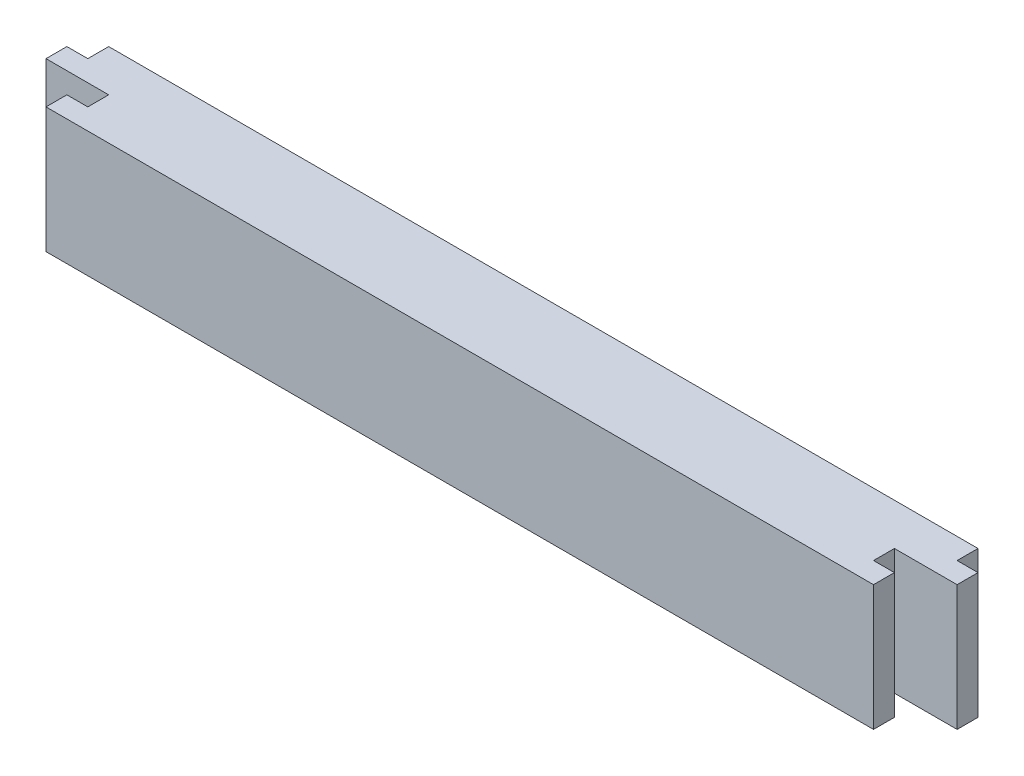
ISO-10303-21;
HEADER;
FILE_DESCRIPTION(('STEP AP214'),'2;1');
FILE_NAME('part.step','',(''),(''),'','','');
FILE_SCHEMA(('AUTOMOTIVE_DESIGN { 1 0 10303 214 1 1 1 1 }'));
ENDSEC;
DATA;
#1=APPLICATION_CONTEXT('core data for automotive mechanical design processes');
#2=APPLICATION_PROTOCOL_DEFINITION('international standard','automotive_design',2000,#1);
#3=PRODUCT_CONTEXT('',#1,'mechanical');
#4=PRODUCT('Part','Part','',(#3));
#5=PRODUCT_RELATED_PRODUCT_CATEGORY('part','',(#4));
#6=PRODUCT_DEFINITION_FORMATION('','',#4);
#7=PRODUCT_DEFINITION_CONTEXT('part definition',#1,'design');
#8=PRODUCT_DEFINITION('design','',#6,#7);
#9=PRODUCT_DEFINITION_SHAPE('','',#8);
#10=(LENGTH_UNIT() NAMED_UNIT(*) SI_UNIT(.MILLI.,.METRE.));
#11=(NAMED_UNIT(*) PLANE_ANGLE_UNIT() SI_UNIT($,.RADIAN.));
#12=(NAMED_UNIT(*) SI_UNIT($,.STERADIAN.) SOLID_ANGLE_UNIT());
#13=UNCERTAINTY_MEASURE_WITH_UNIT(LENGTH_MEASURE(1.E-05),#10,'distance_accuracy_value','');
#14=(GEOMETRIC_REPRESENTATION_CONTEXT(3) GLOBAL_UNCERTAINTY_ASSIGNED_CONTEXT((#13)) GLOBAL_UNIT_ASSIGNED_CONTEXT((#10,
#11,#12)) REPRESENTATION_CONTEXT('',''));
#15=CARTESIAN_POINT('',(0.,0.,0.));
#16=DIRECTION('',(0.,0.,1.));
#17=DIRECTION('',(1.,0.,0.));
#18=AXIS2_PLACEMENT_3D('',#15,#16,#17);
#19=CARTESIAN_POINT('',(26.,7.5,0.));
#20=DIRECTION('',(-1.,0.,0.));
#21=DIRECTION('',(0.,0.,1.));
#22=AXIS2_PLACEMENT_3D('',#19,#20,#21);
#23=PLANE('',#22);
#24=DIRECTION('',(0.,0.,-1.));
#25=VECTOR('',#24,1.);
#26=CARTESIAN_POINT('',(26.,0.,0.));
#27=LINE('',#26,#25);
#28=CARTESIAN_POINT('',(26.,0.,0.));
#29=VERTEX_POINT('',#28);
#30=CARTESIAN_POINT('',(26.,0.,-1.25));
#31=VERTEX_POINT('',#30);
#32=EDGE_CURVE('E193',#29,#31,#27,.T.);
#33=ORIENTED_EDGE('',*,*,#32,.T.);
#34=DIRECTION('',(0.,-1.,0.));
#35=VECTOR('',#34,1.);
#36=CARTESIAN_POINT('',(26.,7.5,-1.25));
#37=LINE('',#36,#35);
#38=CARTESIAN_POINT('',(26.,7.5,-1.25));
#39=VERTEX_POINT('',#38);
#40=EDGE_CURVE('E11',#39,#31,#37,.T.);
#41=ORIENTED_EDGE('',*,*,#40,.F.);
#42=DIRECTION('',(0.,0.,-1.));
#43=VECTOR('',#42,1.);
#44=CARTESIAN_POINT('',(26.,7.5,0.));
#45=LINE('',#44,#43);
#46=CARTESIAN_POINT('',(26.,7.5,0.));
#47=VERTEX_POINT('',#46);
#48=EDGE_CURVE('E242',#47,#39,#45,.T.);
#49=ORIENTED_EDGE('',*,*,#48,.F.);
#50=DIRECTION('',(0.,-1.,0.));
#51=VECTOR('',#50,1.);
#52=CARTESIAN_POINT('',(26.,7.5,0.));
#53=LINE('',#52,#51);
#54=EDGE_CURVE('E189',#47,#29,#53,.T.);
#55=ORIENTED_EDGE('',*,*,#54,.T.);
#56=EDGE_LOOP('',(#33,#41,#49,#55));
#57=FACE_BOUND('',#56,.T.);
#58=ADVANCED_FACE('F45',(#57),#23,.F.);
#59=CARTESIAN_POINT('',(-26.,7.5,-1.25));
#60=DIRECTION('',(0.,0.,1.));
#61=DIRECTION('',(1.,0.,0.));
#62=AXIS2_PLACEMENT_3D('',#59,#60,#61);
#63=PLANE('',#62);
#64=DIRECTION('',(-1.,0.,0.));
#65=VECTOR('',#64,1.);
#66=CARTESIAN_POINT('',(-26.,0.,-1.25));
#67=LINE('',#66,#65);
#68=CARTESIAN_POINT('',(-26.,0.,-1.25));
#69=VERTEX_POINT('',#68);
#70=EDGE_CURVE('E197',#31,#69,#67,.T.);
#71=ORIENTED_EDGE('',*,*,#70,.T.);
#72=DIRECTION('',(0.,-1.,0.));
#73=VECTOR('',#72,1.);
#74=CARTESIAN_POINT('',(-26.,7.5,-1.25));
#75=LINE('',#74,#73);
#76=CARTESIAN_POINT('',(-26.,7.5,-1.25));
#77=VERTEX_POINT('',#76);
#78=EDGE_CURVE('E54',#77,#69,#75,.T.);
#79=ORIENTED_EDGE('',*,*,#78,.F.);
#80=DIRECTION('',(-1.,0.,0.));
#81=VECTOR('',#80,1.);
#82=CARTESIAN_POINT('',(-26.,7.5,-1.25));
#83=LINE('',#82,#81);
#84=EDGE_CURVE('E129',#39,#77,#83,.T.);
#85=ORIENTED_EDGE('',*,*,#84,.F.);
#86=ORIENTED_EDGE('',*,*,#40,.T.);
#87=EDGE_LOOP('',(#71,#79,#85,#86));
#88=FACE_BOUND('',#87,.T.);
#89=ADVANCED_FACE('F364',(#88),#63,.F.);
#90=CARTESIAN_POINT('',(-26.,7.5,0.));
#91=DIRECTION('',(1.,0.,0.));
#92=DIRECTION('',(0.,0.,-1.));
#93=AXIS2_PLACEMENT_3D('',#90,#91,#92);
#94=PLANE('',#93);
#95=DIRECTION('',(0.,0.,1.));
#96=VECTOR('',#95,1.);
#97=CARTESIAN_POINT('',(-26.,0.,0.));
#98=LINE('',#97,#96);
#99=CARTESIAN_POINT('',(-26.,0.,0.));
#100=VERTEX_POINT('',#99);
#101=EDGE_CURVE('E200',#69,#100,#98,.T.);
#102=ORIENTED_EDGE('',*,*,#101,.T.);
#103=DIRECTION('',(0.,-1.,0.));
#104=VECTOR('',#103,1.);
#105=CARTESIAN_POINT('',(-26.,7.5,0.));
#106=LINE('',#105,#104);
#107=CARTESIAN_POINT('',(-26.,7.5,0.));
#108=VERTEX_POINT('',#107);
#109=EDGE_CURVE('E285',#108,#100,#106,.T.);
#110=ORIENTED_EDGE('',*,*,#109,.F.);
#111=DIRECTION('',(0.,0.,1.));
#112=VECTOR('',#111,1.);
#113=CARTESIAN_POINT('',(-26.,7.5,0.));
#114=LINE('',#113,#112);
#115=EDGE_CURVE('E295',#77,#108,#114,.T.);
#116=ORIENTED_EDGE('',*,*,#115,.F.);
#117=ORIENTED_EDGE('',*,*,#78,.T.);
#118=EDGE_LOOP('',(#102,#110,#116,#117));
#119=FACE_BOUND('',#118,.T.);
#120=ADVANCED_FACE('F293',(#119),#94,.F.);
#121=CARTESIAN_POINT('',(-26.,7.5,0.));
#122=DIRECTION('',(0.,0.,1.));
#123=DIRECTION('',(1.,0.,0.));
#124=AXIS2_PLACEMENT_3D('',#121,#122,#123);
#125=PLANE('',#124);
#126=DIRECTION('',(-1.,0.,0.));
#127=VECTOR('',#126,1.);
#128=CARTESIAN_POINT('',(-26.,0.,0.));
#129=LINE('',#128,#127);
#130=CARTESIAN_POINT('',(-27.25,0.,0.));
#131=VERTEX_POINT('',#130);
#132=EDGE_CURVE('E203',#100,#131,#129,.T.);
#133=ORIENTED_EDGE('',*,*,#132,.T.);
#134=DIRECTION('',(0.,-1.,0.));
#135=VECTOR('',#134,1.);
#136=CARTESIAN_POINT('',(-27.25,7.5,0.));
#137=LINE('',#136,#135);
#138=CARTESIAN_POINT('',(-27.25,7.5,0.));
#139=VERTEX_POINT('',#138);
#140=EDGE_CURVE('E281',#139,#131,#137,.T.);
#141=ORIENTED_EDGE('',*,*,#140,.F.);
#142=DIRECTION('',(-1.,0.,0.));
#143=VECTOR('',#142,1.);
#144=CARTESIAN_POINT('',(-26.,7.5,0.));
#145=LINE('',#144,#143);
#146=EDGE_CURVE('E313',#108,#139,#145,.T.);
#147=ORIENTED_EDGE('',*,*,#146,.F.);
#148=ORIENTED_EDGE('',*,*,#109,.T.);
#149=EDGE_LOOP('',(#133,#141,#147,#148));
#150=FACE_BOUND('',#149,.T.);
#151=ADVANCED_FACE('F303',(#150),#125,.F.);
#152=CARTESIAN_POINT('',(-27.25,7.5,1.25));
#153=DIRECTION('',(1.,0.,0.));
#154=DIRECTION('',(0.,0.,-1.));
#155=AXIS2_PLACEMENT_3D('',#152,#153,#154);
#156=PLANE('',#155);
#157=DIRECTION('',(0.,0.,1.));
#158=VECTOR('',#157,1.);
#159=CARTESIAN_POINT('',(-27.25,0.,1.25));
#160=LINE('',#159,#158);
#161=CARTESIAN_POINT('',(-27.25,0.,1.25));
#162=VERTEX_POINT('',#161);
#163=EDGE_CURVE('E206',#131,#162,#160,.T.);
#164=ORIENTED_EDGE('',*,*,#163,.T.);
#165=DIRECTION('',(0.,-1.,0.));
#166=VECTOR('',#165,1.);
#167=CARTESIAN_POINT('',(-27.25,7.5,1.25));
#168=LINE('',#167,#166);
#169=CARTESIAN_POINT('',(-27.25,7.5,1.25));
#170=VERTEX_POINT('',#169);
#171=EDGE_CURVE('E277',#170,#162,#168,.T.);
#172=ORIENTED_EDGE('',*,*,#171,.F.);
#173=DIRECTION('',(0.,0.,1.));
#174=VECTOR('',#173,1.);
#175=CARTESIAN_POINT('',(-27.25,7.5,1.25));
#176=LINE('',#175,#174);
#177=EDGE_CURVE('E309',#139,#170,#176,.T.);
#178=ORIENTED_EDGE('',*,*,#177,.F.);
#179=ORIENTED_EDGE('',*,*,#140,.T.);
#180=EDGE_LOOP('',(#164,#172,#178,#179));
#181=FACE_BOUND('',#180,.T.);
#182=ADVANCED_FACE('F307',(#181),#156,.F.);
#183=CARTESIAN_POINT('',(-26.,7.5,1.25));
#184=DIRECTION('',(0.,0.,-1.));
#185=DIRECTION('',(-1.,0.,0.));
#186=AXIS2_PLACEMENT_3D('',#183,#184,#185);
#187=PLANE('',#186);
#188=DIRECTION('',(1.,0.,0.));
#189=VECTOR('',#188,1.);
#190=CARTESIAN_POINT('',(-26.,0.,1.25));
#191=LINE('',#190,#189);
#192=CARTESIAN_POINT('',(-23.5,0.,1.25));
#193=VERTEX_POINT('',#192);
#194=EDGE_CURVE('E210',#162,#193,#191,.T.);
#195=ORIENTED_EDGE('',*,*,#194,.T.);
#196=DIRECTION('',(0.,-1.,0.));
#197=VECTOR('',#196,1.);
#198=CARTESIAN_POINT('',(-23.5,7.5,1.25));
#199=LINE('',#198,#197);
#200=CARTESIAN_POINT('',(-23.5,7.5,1.25));
#201=VERTEX_POINT('',#200);
#202=EDGE_CURVE('E273',#201,#193,#199,.T.);
#203=ORIENTED_EDGE('',*,*,#202,.F.);
#204=DIRECTION('',(1.,0.,0.));
#205=VECTOR('',#204,1.);
#206=CARTESIAN_POINT('',(-26.,7.5,1.25));
#207=LINE('',#206,#205);
#208=EDGE_CURVE('E312',#170,#201,#207,.T.);
#209=ORIENTED_EDGE('',*,*,#208,.F.);
#210=ORIENTED_EDGE('',*,*,#171,.T.);
#211=EDGE_LOOP('',(#195,#203,#209,#210));
#212=FACE_BOUND('',#211,.T.);
#213=ADVANCED_FACE('F377',(#212),#187,.F.);
#214=CARTESIAN_POINT('',(-23.5,7.5,2.5));
#215=DIRECTION('',(1.,0.,0.));
#216=DIRECTION('',(0.,0.,-1.));
#217=AXIS2_PLACEMENT_3D('',#214,#215,#216);
#218=PLANE('',#217);
#219=DIRECTION('',(0.,0.,1.));
#220=VECTOR('',#219,1.);
#221=CARTESIAN_POINT('',(-23.5,0.,2.5));
#222=LINE('',#221,#220);
#223=CARTESIAN_POINT('',(-23.5,0.,2.5));
#224=VERTEX_POINT('',#223);
#225=EDGE_CURVE('E213',#193,#224,#222,.T.);
#226=ORIENTED_EDGE('',*,*,#225,.T.);
#227=DIRECTION('',(0.,-1.,0.));
#228=VECTOR('',#227,1.);
#229=CARTESIAN_POINT('',(-23.5,7.5,2.5));
#230=LINE('',#229,#228);
#231=CARTESIAN_POINT('',(-23.5,7.5,2.5));
#232=VERTEX_POINT('',#231);
#233=EDGE_CURVE('E269',#232,#224,#230,.T.);
#234=ORIENTED_EDGE('',*,*,#233,.F.);
#235=DIRECTION('',(0.,0.,1.));
#236=VECTOR('',#235,1.);
#237=CARTESIAN_POINT('',(-23.5,7.5,2.5));
#238=LINE('',#237,#236);
#239=EDGE_CURVE('E317',#201,#232,#238,.T.);
#240=ORIENTED_EDGE('',*,*,#239,.F.);
#241=ORIENTED_EDGE('',*,*,#202,.T.);
#242=EDGE_LOOP('',(#226,#234,#240,#241));
#243=FACE_BOUND('',#242,.T.);
#244=ADVANCED_FACE('F380',(#243),#218,.F.);
#245=CARTESIAN_POINT('',(-23.5,7.5,2.5));
#246=DIRECTION('',(0.,0.,1.));
#247=DIRECTION('',(1.,0.,0.));
#248=AXIS2_PLACEMENT_3D('',#245,#246,#247);
#249=PLANE('',#248);
#250=DIRECTION('',(-1.,0.,0.));
#251=VECTOR('',#250,1.);
#252=CARTESIAN_POINT('',(-23.5,0.,2.5));
#253=LINE('',#252,#251);
#254=CARTESIAN_POINT('',(-24.75,0.,2.5));
#255=VERTEX_POINT('',#254);
#256=EDGE_CURVE('E216',#224,#255,#253,.T.);
#257=ORIENTED_EDGE('',*,*,#256,.T.);
#258=DIRECTION('',(0.,-1.,0.));
#259=VECTOR('',#258,1.);
#260=CARTESIAN_POINT('',(-24.75,7.5,2.5));
#261=LINE('',#260,#259);
#262=CARTESIAN_POINT('',(-24.75,7.5,2.5));
#263=VERTEX_POINT('',#262);
#264=EDGE_CURVE('E265',#263,#255,#261,.T.);
#265=ORIENTED_EDGE('',*,*,#264,.F.);
#266=DIRECTION('',(-1.,0.,0.));
#267=VECTOR('',#266,1.);
#268=CARTESIAN_POINT('',(-23.5,7.5,2.5));
#269=LINE('',#268,#267);
#270=EDGE_CURVE('E324',#232,#263,#269,.T.);
#271=ORIENTED_EDGE('',*,*,#270,.F.);
#272=ORIENTED_EDGE('',*,*,#233,.T.);
#273=EDGE_LOOP('',(#257,#265,#271,#272));
#274=FACE_BOUND('',#273,.T.);
#275=ADVANCED_FACE('F384',(#274),#249,.F.);
#276=CARTESIAN_POINT('',(-24.75,7.5,3.75));
#277=DIRECTION('',(1.,0.,0.));
#278=DIRECTION('',(0.,0.,-1.));
#279=AXIS2_PLACEMENT_3D('',#276,#277,#278);
#280=PLANE('',#279);
#281=DIRECTION('',(0.,0.,1.));
#282=VECTOR('',#281,1.);
#283=CARTESIAN_POINT('',(-24.75,0.,3.75));
#284=LINE('',#283,#282);
#285=CARTESIAN_POINT('',(-24.75,0.,3.75));
#286=VERTEX_POINT('',#285);
#287=EDGE_CURVE('E219',#255,#286,#284,.T.);
#288=ORIENTED_EDGE('',*,*,#287,.T.);
#289=DIRECTION('',(0.,-1.,0.));
#290=VECTOR('',#289,1.);
#291=CARTESIAN_POINT('',(-24.75,7.5,3.75));
#292=LINE('',#291,#290);
#293=CARTESIAN_POINT('',(-24.75,7.5,3.75));
#294=VERTEX_POINT('',#293);
#295=EDGE_CURVE('E261',#294,#286,#292,.T.);
#296=ORIENTED_EDGE('',*,*,#295,.F.);
#297=DIRECTION('',(0.,0.,1.));
#298=VECTOR('',#297,1.);
#299=CARTESIAN_POINT('',(-24.75,7.5,3.75));
#300=LINE('',#299,#298);
#301=EDGE_CURVE('E327',#263,#294,#300,.T.);
#302=ORIENTED_EDGE('',*,*,#301,.F.);
#303=ORIENTED_EDGE('',*,*,#264,.T.);
#304=EDGE_LOOP('',(#288,#296,#302,#303));
#305=FACE_BOUND('',#304,.T.);
#306=ADVANCED_FACE('F388',(#305),#280,.F.);
#307=CARTESIAN_POINT('',(23.5,7.5,3.75));
#308=DIRECTION('',(0.,0.,-1.));
#309=DIRECTION('',(-1.,0.,0.));
#310=AXIS2_PLACEMENT_3D('',#307,#308,#309);
#311=PLANE('',#310);
#312=DIRECTION('',(1.,0.,0.));
#313=VECTOR('',#312,1.);
#314=CARTESIAN_POINT('',(23.5,0.,3.75));
#315=LINE('',#314,#313);
#316=CARTESIAN_POINT('',(24.75,0.,3.75));
#317=VERTEX_POINT('',#316);
#318=EDGE_CURVE('E223',#286,#317,#315,.T.);
#319=ORIENTED_EDGE('',*,*,#318,.T.);
#320=DIRECTION('',(0.,-1.,0.));
#321=VECTOR('',#320,1.);
#322=CARTESIAN_POINT('',(24.75,7.5,3.75));
#323=LINE('',#322,#321);
#324=CARTESIAN_POINT('',(24.75,7.5,3.75));
#325=VERTEX_POINT('',#324);
#326=EDGE_CURVE('E257',#325,#317,#323,.T.);
#327=ORIENTED_EDGE('',*,*,#326,.F.);
#328=DIRECTION('',(1.,0.,0.));
#329=VECTOR('',#328,1.);
#330=CARTESIAN_POINT('',(-23.5,7.5,3.75));
#331=LINE('',#330,#329);
#332=EDGE_CURVE('E330',#294,#325,#331,.T.);
#333=ORIENTED_EDGE('',*,*,#332,.F.);
#334=ORIENTED_EDGE('',*,*,#295,.T.);
#335=EDGE_LOOP('',(#319,#327,#333,#334));
#336=FACE_BOUND('',#335,.T.);
#337=ADVANCED_FACE('F392',(#336),#311,.F.);
#338=CARTESIAN_POINT('',(24.75,7.5,3.75));
#339=DIRECTION('',(-1.,0.,0.));
#340=DIRECTION('',(0.,0.,1.));
#341=AXIS2_PLACEMENT_3D('',#338,#339,#340);
#342=PLANE('',#341);
#343=DIRECTION('',(0.,0.,-1.));
#344=VECTOR('',#343,1.);
#345=CARTESIAN_POINT('',(24.75,0.,3.75));
#346=LINE('',#345,#344);
#347=CARTESIAN_POINT('',(24.75,0.,2.5));
#348=VERTEX_POINT('',#347);
#349=EDGE_CURVE('E226',#317,#348,#346,.T.);
#350=ORIENTED_EDGE('',*,*,#349,.T.);
#351=DIRECTION('',(0.,-1.,0.));
#352=VECTOR('',#351,1.);
#353=CARTESIAN_POINT('',(24.75,7.5,2.5));
#354=LINE('',#353,#352);
#355=CARTESIAN_POINT('',(24.75,7.5,2.5));
#356=VERTEX_POINT('',#355);
#357=EDGE_CURVE('E253',#356,#348,#354,.T.);
#358=ORIENTED_EDGE('',*,*,#357,.F.);
#359=DIRECTION('',(0.,0.,-1.));
#360=VECTOR('',#359,1.);
#361=CARTESIAN_POINT('',(24.75,7.5,3.75));
#362=LINE('',#361,#360);
#363=EDGE_CURVE('E333',#325,#356,#362,.T.);
#364=ORIENTED_EDGE('',*,*,#363,.F.);
#365=ORIENTED_EDGE('',*,*,#326,.T.);
#366=EDGE_LOOP('',(#350,#358,#364,#365));
#367=FACE_BOUND('',#366,.T.);
#368=ADVANCED_FACE('F396',(#367),#342,.F.);
#369=CARTESIAN_POINT('',(23.5,7.5,2.5));
#370=DIRECTION('',(0.,0.,1.));
#371=DIRECTION('',(1.,0.,0.));
#372=AXIS2_PLACEMENT_3D('',#369,#370,#371);
#373=PLANE('',#372);
#374=DIRECTION('',(-1.,0.,0.));
#375=VECTOR('',#374,1.);
#376=CARTESIAN_POINT('',(23.5,0.,2.5));
#377=LINE('',#376,#375);
#378=CARTESIAN_POINT('',(23.5,0.,2.5));
#379=VERTEX_POINT('',#378);
#380=EDGE_CURVE('E229',#348,#379,#377,.T.);
#381=ORIENTED_EDGE('',*,*,#380,.T.);
#382=DIRECTION('',(0.,-1.,0.));
#383=VECTOR('',#382,1.);
#384=CARTESIAN_POINT('',(23.5,7.5,2.5));
#385=LINE('',#384,#383);
#386=CARTESIAN_POINT('',(23.5,7.5,2.5));
#387=VERTEX_POINT('',#386);
#388=EDGE_CURVE('E249',#387,#379,#385,.T.);
#389=ORIENTED_EDGE('',*,*,#388,.F.);
#390=DIRECTION('',(-1.,0.,0.));
#391=VECTOR('',#390,1.);
#392=CARTESIAN_POINT('',(23.5,7.5,2.5));
#393=LINE('',#392,#391);
#394=EDGE_CURVE('E336',#356,#387,#393,.T.);
#395=ORIENTED_EDGE('',*,*,#394,.F.);
#396=ORIENTED_EDGE('',*,*,#357,.T.);
#397=EDGE_LOOP('',(#381,#389,#395,#396));
#398=FACE_BOUND('',#397,.T.);
#399=ADVANCED_FACE('F344',(#398),#373,.F.);
#400=CARTESIAN_POINT('',(23.5,7.5,2.5));
#401=DIRECTION('',(-1.,0.,0.));
#402=DIRECTION('',(0.,0.,1.));
#403=AXIS2_PLACEMENT_3D('',#400,#401,#402);
#404=PLANE('',#403);
#405=DIRECTION('',(0.,0.,-1.));
#406=VECTOR('',#405,1.);
#407=CARTESIAN_POINT('',(23.5,0.,2.5));
#408=LINE('',#407,#406);
#409=CARTESIAN_POINT('',(23.5,0.,1.25));
#410=VERTEX_POINT('',#409);
#411=EDGE_CURVE('E232',#379,#410,#408,.T.);
#412=ORIENTED_EDGE('',*,*,#411,.T.);
#413=DIRECTION('',(0.,-1.,0.));
#414=VECTOR('',#413,1.);
#415=CARTESIAN_POINT('',(23.5,7.5,1.25));
#416=LINE('',#415,#414);
#417=CARTESIAN_POINT('',(23.5,7.5,1.25));
#418=VERTEX_POINT('',#417);
#419=EDGE_CURVE('E182',#418,#410,#416,.T.);
#420=ORIENTED_EDGE('',*,*,#419,.F.);
#421=DIRECTION('',(0.,0.,-1.));
#422=VECTOR('',#421,1.);
#423=CARTESIAN_POINT('',(23.5,7.5,2.5));
#424=LINE('',#423,#422);
#425=EDGE_CURVE('E172',#387,#418,#424,.T.);
#426=ORIENTED_EDGE('',*,*,#425,.F.);
#427=ORIENTED_EDGE('',*,*,#388,.T.);
#428=EDGE_LOOP('',(#412,#420,#426,#427));
#429=FACE_BOUND('',#428,.T.);
#430=ADVANCED_FACE('F348',(#429),#404,.F.);
#431=CARTESIAN_POINT('',(26.,7.5,1.25));
#432=DIRECTION('',(0.,0.,-1.));
#433=DIRECTION('',(-1.,0.,0.));
#434=AXIS2_PLACEMENT_3D('',#431,#432,#433);
#435=PLANE('',#434);
#436=DIRECTION('',(1.,0.,0.));
#437=VECTOR('',#436,1.);
#438=CARTESIAN_POINT('',(26.,0.,1.25));
#439=LINE('',#438,#437);
#440=CARTESIAN_POINT('',(27.25,0.,1.25));
#441=VERTEX_POINT('',#440);
#442=EDGE_CURVE('E180',#410,#441,#439,.T.);
#443=ORIENTED_EDGE('',*,*,#442,.T.);
#444=DIRECTION('',(0.,-1.,0.));
#445=VECTOR('',#444,1.);
#446=CARTESIAN_POINT('',(27.25,7.5,1.25));
#447=LINE('',#446,#445);
#448=CARTESIAN_POINT('',(27.25,7.5,1.25));
#449=VERTEX_POINT('',#448);
#450=EDGE_CURVE('E178',#449,#441,#447,.T.);
#451=ORIENTED_EDGE('',*,*,#450,.F.);
#452=DIRECTION('',(1.,0.,0.));
#453=VECTOR('',#452,1.);
#454=CARTESIAN_POINT('',(23.5,7.5,1.25));
#455=LINE('',#454,#453);
#456=EDGE_CURVE('E166',#418,#449,#455,.T.);
#457=ORIENTED_EDGE('',*,*,#456,.F.);
#458=ORIENTED_EDGE('',*,*,#419,.T.);
#459=EDGE_LOOP('',(#443,#451,#457,#458));
#460=FACE_BOUND('',#459,.T.);
#461=ADVANCED_FACE('F179',(#460),#435,.F.);
#462=CARTESIAN_POINT('',(27.25,7.5,1.25));
#463=DIRECTION('',(-1.,0.,0.));
#464=DIRECTION('',(0.,0.,1.));
#465=AXIS2_PLACEMENT_3D('',#462,#463,#464);
#466=PLANE('',#465);
#467=DIRECTION('',(0.,0.,-1.));
#468=VECTOR('',#467,1.);
#469=CARTESIAN_POINT('',(27.25,0.,1.25));
#470=LINE('',#469,#468);
#471=CARTESIAN_POINT('',(27.25,0.,0.));
#472=VERTEX_POINT('',#471);
#473=EDGE_CURVE('E115',#441,#472,#470,.T.);
#474=ORIENTED_EDGE('',*,*,#473,.T.);
#475=DIRECTION('',(0.,-1.,0.));
#476=VECTOR('',#475,1.);
#477=CARTESIAN_POINT('',(27.25,7.5,0.));
#478=LINE('',#477,#476);
#479=CARTESIAN_POINT('',(27.25,7.5,0.));
#480=VERTEX_POINT('',#479);
#481=EDGE_CURVE('E183',#480,#472,#478,.T.);
#482=ORIENTED_EDGE('',*,*,#481,.F.);
#483=DIRECTION('',(0.,0.,-1.));
#484=VECTOR('',#483,1.);
#485=CARTESIAN_POINT('',(27.25,7.5,1.25));
#486=LINE('',#485,#484);
#487=EDGE_CURVE('E170',#449,#480,#486,.T.);
#488=ORIENTED_EDGE('',*,*,#487,.F.);
#489=ORIENTED_EDGE('',*,*,#450,.T.);
#490=EDGE_LOOP('',(#474,#482,#488,#489));
#491=FACE_BOUND('',#490,.T.);
#492=ADVANCED_FACE('F185',(#491),#466,.F.);
#493=CARTESIAN_POINT('',(26.,7.5,0.));
#494=DIRECTION('',(0.,0.,1.));
#495=DIRECTION('',(1.,0.,0.));
#496=AXIS2_PLACEMENT_3D('',#493,#494,#495);
#497=PLANE('',#496);
#498=DIRECTION('',(-1.,0.,0.));
#499=VECTOR('',#498,1.);
#500=CARTESIAN_POINT('',(26.,0.,0.));
#501=LINE('',#500,#499);
#502=EDGE_CURVE('E121',#472,#29,#501,.T.);
#503=ORIENTED_EDGE('',*,*,#502,.T.);
#504=ORIENTED_EDGE('',*,*,#54,.F.);
#505=DIRECTION('',(-1.,0.,0.));
#506=VECTOR('',#505,1.);
#507=CARTESIAN_POINT('',(26.,7.5,0.));
#508=LINE('',#507,#506);
#509=EDGE_CURVE('E62',#480,#47,#508,.T.);
#510=ORIENTED_EDGE('',*,*,#509,.F.);
#511=ORIENTED_EDGE('',*,*,#481,.T.);
#512=EDGE_LOOP('',(#503,#504,#510,#511));
#513=FACE_BOUND('',#512,.T.);
#514=ADVANCED_FACE('F353',(#513),#497,.F.);
#515=CARTESIAN_POINT('',(0.,7.5,0.));
#516=DIRECTION('',(0.,-1.,0.));
#517=DIRECTION('',(0.,0.,-1.));
#518=AXIS2_PLACEMENT_3D('',#515,#516,#517);
#519=PLANE('',#518);
#520=ORIENTED_EDGE('',*,*,#48,.T.);
#521=ORIENTED_EDGE('',*,*,#84,.T.);
#522=ORIENTED_EDGE('',*,*,#115,.T.);
#523=ORIENTED_EDGE('',*,*,#146,.T.);
#524=ORIENTED_EDGE('',*,*,#177,.T.);
#525=ORIENTED_EDGE('',*,*,#208,.T.);
#526=ORIENTED_EDGE('',*,*,#239,.T.);
#527=ORIENTED_EDGE('',*,*,#270,.T.);
#528=ORIENTED_EDGE('',*,*,#301,.T.);
#529=ORIENTED_EDGE('',*,*,#332,.T.);
#530=ORIENTED_EDGE('',*,*,#363,.T.);
#531=ORIENTED_EDGE('',*,*,#394,.T.);
#532=ORIENTED_EDGE('',*,*,#425,.T.);
#533=ORIENTED_EDGE('',*,*,#456,.T.);
#534=ORIENTED_EDGE('',*,*,#487,.T.);
#535=ORIENTED_EDGE('',*,*,#509,.T.);
#536=EDGE_LOOP('',(#520,#521,#522,#523,#524,#525,#526,#527,#528,#529,#530,#531,#532,#533,#534,#535));
#537=FACE_BOUND('',#536,.T.);
#538=ADVANCED_FACE('F168',(#537),#519,.F.);
#539=CARTESIAN_POINT('',(0.,0.,0.));
#540=DIRECTION('',(0.,-1.,0.));
#541=DIRECTION('',(0.,0.,-1.));
#542=AXIS2_PLACEMENT_3D('',#539,#540,#541);
#543=PLANE('',#542);
#544=ORIENTED_EDGE('',*,*,#32,.F.);
#545=ORIENTED_EDGE('',*,*,#502,.F.);
#546=ORIENTED_EDGE('',*,*,#473,.F.);
#547=ORIENTED_EDGE('',*,*,#442,.F.);
#548=ORIENTED_EDGE('',*,*,#411,.F.);
#549=ORIENTED_EDGE('',*,*,#380,.F.);
#550=ORIENTED_EDGE('',*,*,#349,.F.);
#551=ORIENTED_EDGE('',*,*,#318,.F.);
#552=ORIENTED_EDGE('',*,*,#287,.F.);
#553=ORIENTED_EDGE('',*,*,#256,.F.);
#554=ORIENTED_EDGE('',*,*,#225,.F.);
#555=ORIENTED_EDGE('',*,*,#194,.F.);
#556=ORIENTED_EDGE('',*,*,#163,.F.);
#557=ORIENTED_EDGE('',*,*,#132,.F.);
#558=ORIENTED_EDGE('',*,*,#101,.F.);
#559=ORIENTED_EDGE('',*,*,#70,.F.);
#560=EDGE_LOOP('',(#544,#545,#546,#547,#548,#549,#550,#551,#552,#553,#554,#555,#556,#557,#558,#559));
#561=FACE_BOUND('',#560,.T.);
#562=ADVANCED_FACE('F299',(#561),#543,.T.);
#563=CLOSED_SHELL('',(#58,#89,#120,#151,#182,#213,#244,#275,#306,#337,#368,#399,#430,#461,#492,
#514,#538,#562));
#564=MANIFOLD_SOLID_BREP('B2',#563);
#565=ADVANCED_BREP_SHAPE_REPRESENTATION('',(#18,#564),#14);
#566=SHAPE_DEFINITION_REPRESENTATION(#9,#565);
ENDSEC;
END-ISO-10303-21;
